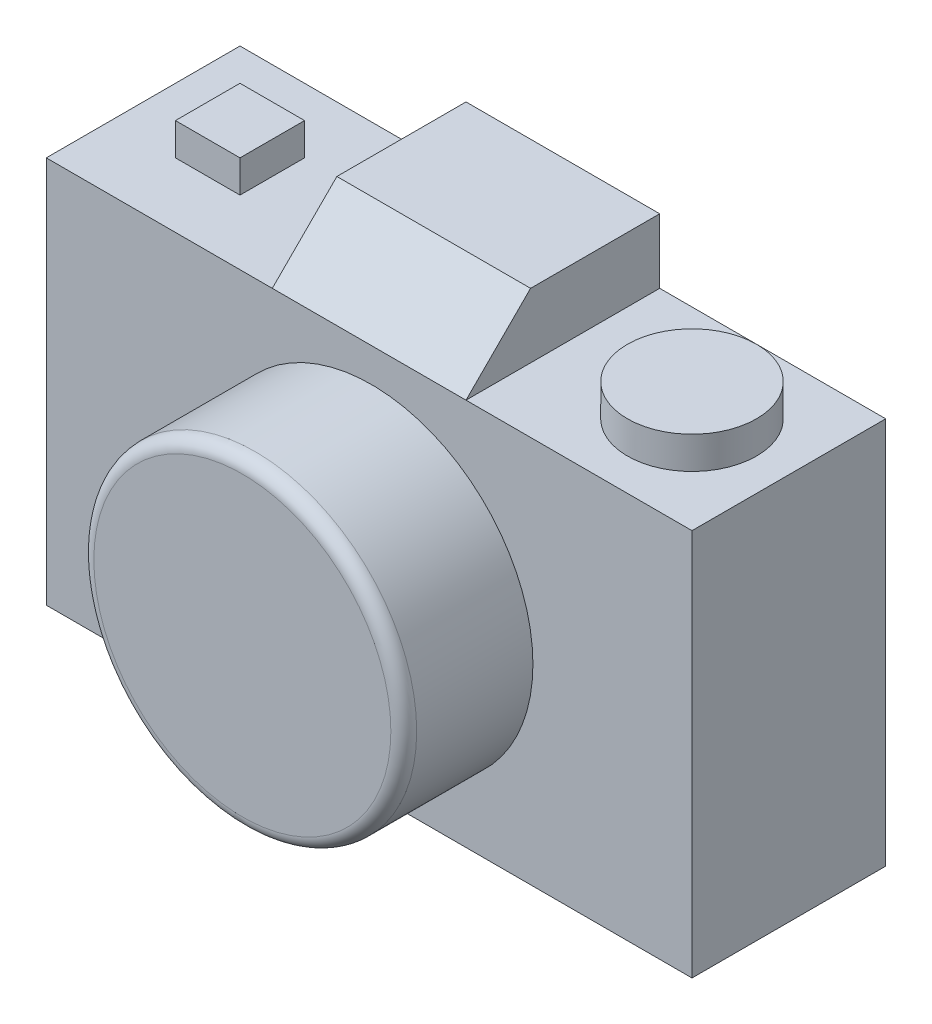
ISO-10303-21;
HEADER;
FILE_DESCRIPTION(('STEP AP214'),'2;1');
FILE_NAME('part.step','',(''),(''),'','','');
FILE_SCHEMA(('AUTOMOTIVE_DESIGN { 1 0 10303 214 1 1 1 1 }'));
ENDSEC;
DATA;
#1=APPLICATION_CONTEXT('core data for automotive mechanical design processes');
#2=APPLICATION_PROTOCOL_DEFINITION('international standard','automotive_design',2000,#1);
#3=PRODUCT_CONTEXT('',#1,'mechanical');
#4=PRODUCT('Part','Part','',(#3));
#5=PRODUCT_RELATED_PRODUCT_CATEGORY('part','',(#4));
#6=PRODUCT_DEFINITION_FORMATION('','',#4);
#7=PRODUCT_DEFINITION_CONTEXT('part definition',#1,'design');
#8=PRODUCT_DEFINITION('design','',#6,#7);
#9=PRODUCT_DEFINITION_SHAPE('','',#8);
#10=(LENGTH_UNIT() NAMED_UNIT(*) SI_UNIT(.MILLI.,.METRE.));
#11=(NAMED_UNIT(*) PLANE_ANGLE_UNIT() SI_UNIT($,.RADIAN.));
#12=(NAMED_UNIT(*) SI_UNIT($,.STERADIAN.) SOLID_ANGLE_UNIT());
#13=UNCERTAINTY_MEASURE_WITH_UNIT(LENGTH_MEASURE(1.E-05),#10,'distance_accuracy_value','');
#14=(GEOMETRIC_REPRESENTATION_CONTEXT(3) GLOBAL_UNCERTAINTY_ASSIGNED_CONTEXT((#13)) GLOBAL_UNIT_ASSIGNED_CONTEXT((#10,
#11,#12)) REPRESENTATION_CONTEXT('',''));
#15=CARTESIAN_POINT('',(0.,0.,0.));
#16=DIRECTION('',(0.,0.,1.));
#17=DIRECTION('',(1.,0.,0.));
#18=AXIS2_PLACEMENT_3D('',#15,#16,#17);
#19=CARTESIAN_POINT('',(52.8020565552699,27.6092544987146,30.));
#20=DIRECTION('',(0.,-1.,0.));
#21=DIRECTION('',(1.,0.,0.));
#22=AXIS2_PLACEMENT_3D('',#19,#20,#21);
#23=PLANE('',#22);
#24=CARTESIAN_POINT('',(37.8020565552699,27.6092544987146,15.));
#25=DIRECTION('',(0.,-1.,0.));
#26=DIRECTION('',(1.,0.,0.));
#27=AXIS2_PLACEMENT_3D('',#24,#25,#26);
#28=CIRCLE('',#27,10.);
#29=CARTESIAN_POINT('',(47.8020565552699,27.6092544987146,15.));
#30=VERTEX_POINT('',#29);
#31=EDGE_CURVE('E192',#30,#30,#28,.F.);
#32=ORIENTED_EDGE('',*,*,#31,.F.);
#33=EDGE_LOOP('',(#32));
#34=FACE_BOUND('',#33,.T.);
#35=DIRECTION('',(0.,0.,-1.));
#36=VECTOR('',#35,1.);
#37=CARTESIAN_POINT('',(17.8020565552699,27.6092544987146,0.));
#38=LINE('',#37,#36);
#39=CARTESIAN_POINT('',(17.8020565552699,27.6092544987146,30.));
#40=VERTEX_POINT('',#39);
#41=CARTESIAN_POINT('',(17.8020565552699,27.6092544987146,0.));
#42=VERTEX_POINT('',#41);
#43=EDGE_CURVE('E147',#40,#42,#38,.T.);
#44=ORIENTED_EDGE('',*,*,#43,.F.);
#45=DIRECTION('',(-1.,0.,0.));
#46=VECTOR('',#45,1.);
#47=CARTESIAN_POINT('',(52.8020565552699,27.6092544987146,30.));
#48=LINE('',#47,#46);
#49=CARTESIAN_POINT('',(52.8020565552699,27.6092544987146,30.));
#50=VERTEX_POINT('',#49);
#51=EDGE_CURVE('E203',#50,#40,#48,.T.);
#52=ORIENTED_EDGE('',*,*,#51,.F.);
#53=DIRECTION('',(0.,0.,-1.));
#54=VECTOR('',#53,1.);
#55=CARTESIAN_POINT('',(52.8020565552699,27.6092544987146,30.));
#56=LINE('',#55,#54);
#57=CARTESIAN_POINT('',(52.8020565552699,27.6092544987146,0.));
#58=VERTEX_POINT('',#57);
#59=EDGE_CURVE('E217',#50,#58,#56,.T.);
#60=ORIENTED_EDGE('',*,*,#59,.T.);
#61=DIRECTION('',(-1.,0.,0.));
#62=VECTOR('',#61,1.);
#63=CARTESIAN_POINT('',(52.8020565552699,27.6092544987146,0.));
#64=LINE('',#63,#62);
#65=EDGE_CURVE('E198',#58,#42,#64,.T.);
#66=ORIENTED_EDGE('',*,*,#65,.T.);
#67=EDGE_LOOP('',(#44,#52,#60,#66));
#68=FACE_BOUND('',#67,.T.);
#69=ADVANCED_FACE('F33',(#34,#68),#23,.F.);
#70=DIRECTION('',(0.,0.,-1.));
#71=VECTOR('',#70,1.);
#72=CARTESIAN_POINT('',(-27.1979434447301,27.6092544987147,10.));
#73=LINE('',#72,#71);
#74=CARTESIAN_POINT('',(-27.1979434447301,27.6092544987147,20.));
#75=VERTEX_POINT('',#74);
#76=CARTESIAN_POINT('',(-27.1979434447301,27.6092544987147,10.));
#77=VERTEX_POINT('',#76);
#78=EDGE_CURVE('E151',#75,#77,#73,.T.);
#79=ORIENTED_EDGE('',*,*,#78,.F.);
#80=DIRECTION('',(1.,0.,0.));
#81=VECTOR('',#80,1.);
#82=CARTESIAN_POINT('',(-37.1979434447301,27.6092544987147,20.));
#83=LINE('',#82,#81);
#84=CARTESIAN_POINT('',(-37.1979434447301,27.6092544987147,20.));
#85=VERTEX_POINT('',#84);
#86=EDGE_CURVE('E160',#85,#75,#83,.T.);
#87=ORIENTED_EDGE('',*,*,#86,.F.);
#88=DIRECTION('',(0.,0.,1.));
#89=VECTOR('',#88,1.);
#90=CARTESIAN_POINT('',(-37.1979434447301,27.6092544987147,10.));
#91=LINE('',#90,#89);
#92=CARTESIAN_POINT('',(-37.1979434447301,27.6092544987147,10.));
#93=VERTEX_POINT('',#92);
#94=EDGE_CURVE('E172',#93,#85,#91,.T.);
#95=ORIENTED_EDGE('',*,*,#94,.F.);
#96=DIRECTION('',(-1.,0.,0.));
#97=VECTOR('',#96,1.);
#98=CARTESIAN_POINT('',(-37.1979434447301,27.6092544987147,10.));
#99=LINE('',#98,#97);
#100=EDGE_CURVE('E169',#77,#93,#99,.T.);
#101=ORIENTED_EDGE('',*,*,#100,.F.);
#102=EDGE_LOOP('',(#79,#87,#95,#101));
#103=FACE_BOUND('',#102,.T.);
#104=DIRECTION('',(0.,0.,1.));
#105=VECTOR('',#104,1.);
#106=CARTESIAN_POINT('',(-12.1979434447301,27.6092544987147,0.));
#107=LINE('',#106,#105);
#108=CARTESIAN_POINT('',(-12.1979434447301,27.6092544987147,0.));
#109=VERTEX_POINT('',#108);
#110=CARTESIAN_POINT('',(-12.1979434447301,27.6092544987147,30.));
#111=VERTEX_POINT('',#110);
#112=EDGE_CURVE('E132',#109,#111,#107,.T.);
#113=ORIENTED_EDGE('',*,*,#112,.F.);
#114=CARTESIAN_POINT('',(-47.1979434447301,27.6092544987147,0.));
#115=VERTEX_POINT('',#114);
#116=EDGE_CURVE('E213',#109,#115,#64,.T.);
#117=ORIENTED_EDGE('',*,*,#116,.T.);
#118=DIRECTION('',(0.,0.,-1.));
#119=VECTOR('',#118,1.);
#120=CARTESIAN_POINT('',(-47.1979434447301,27.6092544987147,30.));
#121=LINE('',#120,#119);
#122=CARTESIAN_POINT('',(-47.1979434447301,27.6092544987147,30.));
#123=VERTEX_POINT('',#122);
#124=EDGE_CURVE('E206',#123,#115,#121,.T.);
#125=ORIENTED_EDGE('',*,*,#124,.F.);
#126=EDGE_CURVE('E202',#111,#123,#48,.T.);
#127=ORIENTED_EDGE('',*,*,#126,.F.);
#128=EDGE_LOOP('',(#113,#117,#125,#127));
#129=FACE_BOUND('',#128,.T.);
#130=ADVANCED_FACE('F244',(#103,#129),#23,.F.);
#131=CARTESIAN_POINT('',(-47.1979434447301,27.6092544987147,30.));
#132=DIRECTION('',(1.,0.,0.));
#133=DIRECTION('',(0.,0.,-1.));
#134=AXIS2_PLACEMENT_3D('',#131,#132,#133);
#135=PLANE('',#134);
#136=DIRECTION('',(0.,-1.,0.));
#137=VECTOR('',#136,1.);
#138=CARTESIAN_POINT('',(-47.1979434447301,27.6092544987147,0.));
#139=LINE('',#138,#137);
#140=CARTESIAN_POINT('',(-47.1979434447301,-32.3907455012854,0.));
#141=VERTEX_POINT('',#140);
#142=EDGE_CURVE('E188',#115,#141,#139,.T.);
#143=ORIENTED_EDGE('',*,*,#142,.T.);
#144=DIRECTION('',(0.,0.,-1.));
#145=VECTOR('',#144,1.);
#146=CARTESIAN_POINT('',(-47.1979434447301,-32.3907455012854,30.));
#147=LINE('',#146,#145);
#148=CARTESIAN_POINT('',(-47.1979434447301,-32.3907455012854,30.));
#149=VERTEX_POINT('',#148);
#150=EDGE_CURVE('E193',#149,#141,#147,.T.);
#151=ORIENTED_EDGE('',*,*,#150,.F.);
#152=DIRECTION('',(0.,-1.,0.));
#153=VECTOR('',#152,1.);
#154=CARTESIAN_POINT('',(-47.1979434447301,27.6092544987147,30.));
#155=LINE('',#154,#153);
#156=EDGE_CURVE('E194',#123,#149,#155,.T.);
#157=ORIENTED_EDGE('',*,*,#156,.F.);
#158=ORIENTED_EDGE('',*,*,#124,.T.);
#159=EDGE_LOOP('',(#143,#151,#157,#158));
#160=FACE_BOUND('',#159,.T.);
#161=ADVANCED_FACE('F250',(#160),#135,.F.);
#162=CARTESIAN_POINT('',(-47.1979434447301,-32.3907455012854,30.));
#163=DIRECTION('',(0.,1.,0.));
#164=DIRECTION('',(0.,0.,1.));
#165=AXIS2_PLACEMENT_3D('',#162,#163,#164);
#166=PLANE('',#165);
#167=DIRECTION('',(1.,0.,0.));
#168=VECTOR('',#167,1.);
#169=CARTESIAN_POINT('',(-47.1979434447301,-32.3907455012854,0.));
#170=LINE('',#169,#168);
#171=CARTESIAN_POINT('',(52.8020565552699,-32.3907455012854,0.));
#172=VERTEX_POINT('',#171);
#173=EDGE_CURVE('E209',#141,#172,#170,.T.);
#174=ORIENTED_EDGE('',*,*,#173,.T.);
#175=DIRECTION('',(0.,0.,-1.));
#176=VECTOR('',#175,1.);
#177=CARTESIAN_POINT('',(52.8020565552699,-32.3907455012854,30.));
#178=LINE('',#177,#176);
#179=CARTESIAN_POINT('',(52.8020565552699,-32.3907455012854,30.));
#180=VERTEX_POINT('',#179);
#181=EDGE_CURVE('E220',#180,#172,#178,.T.);
#182=ORIENTED_EDGE('',*,*,#181,.F.);
#183=DIRECTION('',(1.,0.,0.));
#184=VECTOR('',#183,1.);
#185=CARTESIAN_POINT('',(-47.1979434447301,-32.3907455012854,30.));
#186=LINE('',#185,#184);
#187=EDGE_CURVE('E197',#149,#180,#186,.T.);
#188=ORIENTED_EDGE('',*,*,#187,.F.);
#189=ORIENTED_EDGE('',*,*,#150,.T.);
#190=EDGE_LOOP('',(#174,#182,#188,#189));
#191=FACE_BOUND('',#190,.T.);
#192=ADVANCED_FACE('F261',(#191),#166,.F.);
#193=CARTESIAN_POINT('',(52.8020565552699,-32.3907455012854,30.));
#194=DIRECTION('',(-1.,0.,0.));
#195=DIRECTION('',(0.,0.,1.));
#196=AXIS2_PLACEMENT_3D('',#193,#194,#195);
#197=PLANE('',#196);
#198=DIRECTION('',(0.,1.,0.));
#199=VECTOR('',#198,1.);
#200=CARTESIAN_POINT('',(52.8020565552699,-32.3907455012854,0.));
#201=LINE('',#200,#199);
#202=EDGE_CURVE('E211',#172,#58,#201,.T.);
#203=ORIENTED_EDGE('',*,*,#202,.T.);
#204=ORIENTED_EDGE('',*,*,#59,.F.);
#205=DIRECTION('',(0.,1.,0.));
#206=VECTOR('',#205,1.);
#207=CARTESIAN_POINT('',(52.8020565552699,-32.3907455012854,30.));
#208=LINE('',#207,#206);
#209=EDGE_CURVE('E200',#180,#50,#208,.T.);
#210=ORIENTED_EDGE('',*,*,#209,.F.);
#211=ORIENTED_EDGE('',*,*,#181,.T.);
#212=EDGE_LOOP('',(#203,#204,#210,#211));
#213=FACE_BOUND('',#212,.T.);
#214=ADVANCED_FACE('F257',(#213),#197,.F.);
#215=CARTESIAN_POINT('',(0.,0.,30.));
#216=DIRECTION('',(0.,0.,1.));
#217=DIRECTION('',(1.,0.,0.));
#218=AXIS2_PLACEMENT_3D('',#215,#216,#217);
#219=PLANE('',#218);
#220=CARTESIAN_POINT('',(3.16571328794909,-2.60893954089285,30.));
#221=DIRECTION('',(0.,0.,1.));
#222=DIRECTION('',(1.,0.,0.));
#223=AXIS2_PLACEMENT_3D('',#220,#221,#222);
#224=CIRCLE('',#223,25.);
#225=CARTESIAN_POINT('',(28.1657132879491,-2.60893954089285,30.));
#226=VERTEX_POINT('',#225);
#227=EDGE_CURVE('E189',#226,#226,#224,.T.);
#228=ORIENTED_EDGE('',*,*,#227,.F.);
#229=EDGE_LOOP('',(#228));
#230=FACE_BOUND('',#229,.T.);
#231=ORIENTED_EDGE('',*,*,#51,.T.);
#232=DIRECTION('',(-1.,0.,0.));
#233=VECTOR('',#232,1.);
#234=CARTESIAN_POINT('',(0.,27.6092544987146,30.));
#235=LINE('',#234,#233);
#236=EDGE_CURVE('E229',#40,#111,#235,.T.);
#237=ORIENTED_EDGE('',*,*,#236,.T.);
#238=ORIENTED_EDGE('',*,*,#126,.T.);
#239=ORIENTED_EDGE('',*,*,#156,.T.);
#240=ORIENTED_EDGE('',*,*,#187,.T.);
#241=ORIENTED_EDGE('',*,*,#209,.T.);
#242=EDGE_LOOP('',(#231,#237,#238,#239,#240,#241));
#243=FACE_BOUND('',#242,.T.);
#244=ADVANCED_FACE('F260',(#230,#243),#219,.T.);
#245=CARTESIAN_POINT('',(0.,0.,0.));
#246=DIRECTION('',(0.,0.,1.));
#247=DIRECTION('',(1.,0.,0.));
#248=AXIS2_PLACEMENT_3D('',#245,#246,#247);
#249=PLANE('',#248);
#250=ORIENTED_EDGE('',*,*,#142,.F.);
#251=ORIENTED_EDGE('',*,*,#116,.F.);
#252=DIRECTION('',(0.,-1.,0.));
#253=VECTOR('',#252,1.);
#254=CARTESIAN_POINT('',(-12.1979434447301,37.6092544987147,0.));
#255=LINE('',#254,#253);
#256=CARTESIAN_POINT('',(-12.1979434447301,37.6092544987147,0.));
#257=VERTEX_POINT('',#256);
#258=EDGE_CURVE('E142',#257,#109,#255,.T.);
#259=ORIENTED_EDGE('',*,*,#258,.F.);
#260=DIRECTION('',(-1.,0.,0.));
#261=VECTOR('',#260,1.);
#262=CARTESIAN_POINT('',(-12.1979434447301,37.6092544987147,0.));
#263=LINE('',#262,#261);
#264=CARTESIAN_POINT('',(17.8020565552699,37.6092544987146,0.));
#265=VERTEX_POINT('',#264);
#266=EDGE_CURVE('E127',#265,#257,#263,.T.);
#267=ORIENTED_EDGE('',*,*,#266,.F.);
#268=DIRECTION('',(0.,-1.,0.));
#269=VECTOR('',#268,1.);
#270=CARTESIAN_POINT('',(17.8020565552699,37.6092544987146,0.));
#271=LINE('',#270,#269);
#272=EDGE_CURVE('E139',#265,#42,#271,.T.);
#273=ORIENTED_EDGE('',*,*,#272,.T.);
#274=ORIENTED_EDGE('',*,*,#65,.F.);
#275=ORIENTED_EDGE('',*,*,#202,.F.);
#276=ORIENTED_EDGE('',*,*,#173,.F.);
#277=EDGE_LOOP('',(#250,#251,#259,#267,#273,#274,#275,#276));
#278=FACE_BOUND('',#277,.T.);
#279=ADVANCED_FACE('F137',(#278),#249,.F.);
#280=CARTESIAN_POINT('',(3.16571328794909,-2.60893954089285,50.));
#281=DIRECTION('',(0.,0.,-1.));
#282=DIRECTION('',(-1.,0.,0.));
#283=AXIS2_PLACEMENT_3D('',#280,#281,#282);
#284=CYLINDRICAL_SURFACE('',#283,25.);
#285=CARTESIAN_POINT('',(3.16571328794909,-2.60893954089285,48.));
#286=DIRECTION('',(0.,0.,1.));
#287=DIRECTION('',(1.,0.,0.));
#288=AXIS2_PLACEMENT_3D('',#285,#286,#287);
#289=CIRCLE('',#288,25.);
#290=CARTESIAN_POINT('',(28.1657132879491,-2.60893954089285,48.));
#291=VERTEX_POINT('',#290);
#292=EDGE_CURVE('E11',#291,#291,#289,.F.);
#293=ORIENTED_EDGE('',*,*,#292,.T.);
#294=EDGE_LOOP('',(#293));
#295=FACE_BOUND('',#294,.T.);
#296=ORIENTED_EDGE('',*,*,#227,.T.);
#297=EDGE_LOOP('',(#296));
#298=FACE_BOUND('',#297,.T.);
#299=ADVANCED_FACE('F322',(#295,#298),#284,.T.);
#300=CARTESIAN_POINT('',(3.16571328794909,-2.60893954089285,50.));
#301=DIRECTION('',(0.,0.,1.));
#302=DIRECTION('',(1.,0.,0.));
#303=AXIS2_PLACEMENT_3D('',#300,#301,#302);
#304=PLANE('',#303);
#305=CARTESIAN_POINT('',(3.16571328794909,-2.60893954089285,50.));
#306=DIRECTION('',(0.,0.,1.));
#307=DIRECTION('',(1.,0.,0.));
#308=AXIS2_PLACEMENT_3D('',#305,#306,#307);
#309=CIRCLE('',#308,23.);
#310=CARTESIAN_POINT('',(26.1657132879491,-2.60893954089285,50.));
#311=VERTEX_POINT('',#310);
#312=EDGE_CURVE('E41',#311,#311,#309,.T.);
#313=ORIENTED_EDGE('',*,*,#312,.T.);
#314=EDGE_LOOP('',(#313));
#315=FACE_BOUND('',#314,.T.);
#316=ADVANCED_FACE('F234',(#315),#304,.T.);
#317=CARTESIAN_POINT('',(-27.1979434447301,32.6092544987147,10.));
#318=DIRECTION('',(-1.,0.,0.));
#319=DIRECTION('',(0.,0.,1.));
#320=AXIS2_PLACEMENT_3D('',#317,#318,#319);
#321=PLANE('',#320);
#322=ORIENTED_EDGE('',*,*,#78,.T.);
#323=DIRECTION('',(0.,-1.,0.));
#324=VECTOR('',#323,1.);
#325=CARTESIAN_POINT('',(-27.1979434447301,32.6092544987147,10.));
#326=LINE('',#325,#324);
#327=CARTESIAN_POINT('',(-27.1979434447301,32.6092544987147,10.));
#328=VERTEX_POINT('',#327);
#329=EDGE_CURVE('E185',#328,#77,#326,.T.);
#330=ORIENTED_EDGE('',*,*,#329,.F.);
#331=DIRECTION('',(0.,0.,-1.));
#332=VECTOR('',#331,1.);
#333=CARTESIAN_POINT('',(-27.1979434447301,32.6092544987147,10.));
#334=LINE('',#333,#332);
#335=CARTESIAN_POINT('',(-27.1979434447301,32.6092544987147,20.));
#336=VERTEX_POINT('',#335);
#337=EDGE_CURVE('E156',#336,#328,#334,.T.);
#338=ORIENTED_EDGE('',*,*,#337,.F.);
#339=DIRECTION('',(0.,-1.,0.));
#340=VECTOR('',#339,1.);
#341=CARTESIAN_POINT('',(-27.1979434447301,32.6092544987147,20.));
#342=LINE('',#341,#340);
#343=EDGE_CURVE('E166',#336,#75,#342,.T.);
#344=ORIENTED_EDGE('',*,*,#343,.T.);
#345=EDGE_LOOP('',(#322,#330,#338,#344));
#346=FACE_BOUND('',#345,.T.);
#347=ADVANCED_FACE('F315',(#346),#321,.F.);
#348=CARTESIAN_POINT('',(-37.1979434447301,32.6092544987147,10.));
#349=DIRECTION('',(0.,0.,1.));
#350=DIRECTION('',(1.,0.,0.));
#351=AXIS2_PLACEMENT_3D('',#348,#349,#350);
#352=PLANE('',#351);
#353=ORIENTED_EDGE('',*,*,#100,.T.);
#354=DIRECTION('',(0.,-1.,0.));
#355=VECTOR('',#354,1.);
#356=CARTESIAN_POINT('',(-37.1979434447301,32.6092544987147,10.));
#357=LINE('',#356,#355);
#358=CARTESIAN_POINT('',(-37.1979434447301,32.6092544987147,10.));
#359=VERTEX_POINT('',#358);
#360=EDGE_CURVE('E182',#359,#93,#357,.T.);
#361=ORIENTED_EDGE('',*,*,#360,.F.);
#362=DIRECTION('',(-1.,0.,0.));
#363=VECTOR('',#362,1.);
#364=CARTESIAN_POINT('',(-37.1979434447301,32.6092544987147,10.));
#365=LINE('',#364,#363);
#366=EDGE_CURVE('E159',#328,#359,#365,.T.);
#367=ORIENTED_EDGE('',*,*,#366,.F.);
#368=ORIENTED_EDGE('',*,*,#329,.T.);
#369=EDGE_LOOP('',(#353,#361,#367,#368));
#370=FACE_BOUND('',#369,.T.);
#371=ADVANCED_FACE('F311',(#370),#352,.F.);
#372=CARTESIAN_POINT('',(-37.1979434447301,32.6092544987147,10.));
#373=DIRECTION('',(1.,0.,0.));
#374=DIRECTION('',(0.,1.,0.));
#375=AXIS2_PLACEMENT_3D('',#372,#373,#374);
#376=PLANE('',#375);
#377=ORIENTED_EDGE('',*,*,#94,.T.);
#378=DIRECTION('',(0.,-1.,0.));
#379=VECTOR('',#378,1.);
#380=CARTESIAN_POINT('',(-37.1979434447301,32.6092544987147,20.));
#381=LINE('',#380,#379);
#382=CARTESIAN_POINT('',(-37.1979434447301,32.6092544987147,20.));
#383=VERTEX_POINT('',#382);
#384=EDGE_CURVE('E179',#383,#85,#381,.T.);
#385=ORIENTED_EDGE('',*,*,#384,.F.);
#386=DIRECTION('',(0.,0.,1.));
#387=VECTOR('',#386,1.);
#388=CARTESIAN_POINT('',(-37.1979434447301,32.6092544987147,10.));
#389=LINE('',#388,#387);
#390=EDGE_CURVE('E162',#359,#383,#389,.T.);
#391=ORIENTED_EDGE('',*,*,#390,.F.);
#392=ORIENTED_EDGE('',*,*,#360,.T.);
#393=EDGE_LOOP('',(#377,#385,#391,#392));
#394=FACE_BOUND('',#393,.T.);
#395=ADVANCED_FACE('F307',(#394),#376,.F.);
#396=CARTESIAN_POINT('',(-37.1979434447301,32.6092544987147,20.));
#397=DIRECTION('',(0.,0.,-1.));
#398=DIRECTION('',(-1.,0.,0.));
#399=AXIS2_PLACEMENT_3D('',#396,#397,#398);
#400=PLANE('',#399);
#401=ORIENTED_EDGE('',*,*,#86,.T.);
#402=ORIENTED_EDGE('',*,*,#343,.F.);
#403=DIRECTION('',(1.,0.,0.));
#404=VECTOR('',#403,1.);
#405=CARTESIAN_POINT('',(-37.1979434447301,32.6092544987147,20.));
#406=LINE('',#405,#404);
#407=EDGE_CURVE('E164',#383,#336,#406,.T.);
#408=ORIENTED_EDGE('',*,*,#407,.F.);
#409=ORIENTED_EDGE('',*,*,#384,.T.);
#410=EDGE_LOOP('',(#401,#402,#408,#409));
#411=FACE_BOUND('',#410,.T.);
#412=ADVANCED_FACE('F303',(#411),#400,.F.);
#413=CARTESIAN_POINT('',(0.,32.6092544987147,0.));
#414=DIRECTION('',(0.,1.,0.));
#415=DIRECTION('',(0.,0.,1.));
#416=AXIS2_PLACEMENT_3D('',#413,#414,#415);
#417=PLANE('',#416);
#418=ORIENTED_EDGE('',*,*,#337,.T.);
#419=ORIENTED_EDGE('',*,*,#366,.T.);
#420=ORIENTED_EDGE('',*,*,#390,.T.);
#421=ORIENTED_EDGE('',*,*,#407,.T.);
#422=EDGE_LOOP('',(#418,#419,#420,#421));
#423=FACE_BOUND('',#422,.T.);
#424=ADVANCED_FACE('F299',(#423),#417,.T.);
#425=CARTESIAN_POINT('',(37.8020565552699,32.6092544987146,15.));
#426=DIRECTION('',(0.,-1.,0.));
#427=DIRECTION('',(1.,0.,0.));
#428=AXIS2_PLACEMENT_3D('',#425,#426,#427);
#429=CYLINDRICAL_SURFACE('',#428,10.);
#430=CARTESIAN_POINT('',(37.8020565552699,32.6092544987146,15.));
#431=DIRECTION('',(0.,1.,0.));
#432=DIRECTION('',(-1.,0.,0.));
#433=AXIS2_PLACEMENT_3D('',#430,#431,#432);
#434=CIRCLE('',#433,10.);
#435=CARTESIAN_POINT('',(27.8020565552699,32.6092544987146,15.));
#436=VERTEX_POINT('',#435);
#437=EDGE_CURVE('E148',#436,#436,#434,.T.);
#438=ORIENTED_EDGE('',*,*,#437,.F.);
#439=EDGE_LOOP('',(#438));
#440=FACE_BOUND('',#439,.T.);
#441=ORIENTED_EDGE('',*,*,#31,.T.);
#442=EDGE_LOOP('',(#441));
#443=FACE_BOUND('',#442,.T.);
#444=ADVANCED_FACE('F295',(#440,#443),#429,.T.);
#445=CARTESIAN_POINT('',(37.8020565552699,32.6092544987146,15.));
#446=DIRECTION('',(0.,1.,0.));
#447=DIRECTION('',(-1.,0.,0.));
#448=AXIS2_PLACEMENT_3D('',#445,#446,#447);
#449=PLANE('',#448);
#450=ORIENTED_EDGE('',*,*,#437,.T.);
#451=EDGE_LOOP('',(#450));
#452=FACE_BOUND('',#451,.T.);
#453=ADVANCED_FACE('F290',(#452),#449,.T.);
#454=CARTESIAN_POINT('',(17.8020565552699,37.6092544987146,0.));
#455=DIRECTION('',(-1.,0.,0.));
#456=DIRECTION('',(0.,0.,1.));
#457=AXIS2_PLACEMENT_3D('',#454,#455,#456);
#458=PLANE('',#457);
#459=DIRECTION('',(0.,0.,-1.));
#460=VECTOR('',#459,1.);
#461=CARTESIAN_POINT('',(17.8020565552699,37.6092544987146,0.));
#462=LINE('',#461,#460);
#463=CARTESIAN_POINT('',(17.8020565552699,37.6092544987146,20.));
#464=VERTEX_POINT('',#463);
#465=EDGE_CURVE('E124',#464,#265,#462,.T.);
#466=ORIENTED_EDGE('',*,*,#465,.F.);
#467=DIRECTION('',(0.,0.707106781186549,-0.707106781186547));
#468=VECTOR('',#467,1.);
#469=CARTESIAN_POINT('',(17.8020565552699,37.6092544987147,20.));
#470=LINE('',#469,#468);
#471=EDGE_CURVE('E56',#464,#40,#470,.F.);
#472=ORIENTED_EDGE('',*,*,#471,.T.);
#473=ORIENTED_EDGE('',*,*,#43,.T.);
#474=ORIENTED_EDGE('',*,*,#272,.F.);
#475=EDGE_LOOP('',(#466,#472,#473,#474));
#476=FACE_BOUND('',#475,.T.);
#477=ADVANCED_FACE('F145',(#476),#458,.F.);
#478=CARTESIAN_POINT('',(-12.1979434447301,37.6092544987147,0.));
#479=DIRECTION('',(1.,0.,0.));
#480=DIRECTION('',(0.,1.,0.));
#481=AXIS2_PLACEMENT_3D('',#478,#479,#480);
#482=PLANE('',#481);
#483=ORIENTED_EDGE('',*,*,#112,.T.);
#484=DIRECTION('',(0.,-0.707106781186549,0.707106781186547));
#485=VECTOR('',#484,1.);
#486=CARTESIAN_POINT('',(-12.1979434447301,37.6092544987147,20.));
#487=LINE('',#486,#485);
#488=CARTESIAN_POINT('',(-12.1979434447301,37.6092544987147,20.));
#489=VERTEX_POINT('',#488);
#490=EDGE_CURVE('E48',#111,#489,#487,.F.);
#491=ORIENTED_EDGE('',*,*,#490,.T.);
#492=DIRECTION('',(0.,0.,1.));
#493=VECTOR('',#492,1.);
#494=CARTESIAN_POINT('',(-12.1979434447301,37.6092544987147,0.));
#495=LINE('',#494,#493);
#496=EDGE_CURVE('E143',#257,#489,#495,.T.);
#497=ORIENTED_EDGE('',*,*,#496,.F.);
#498=ORIENTED_EDGE('',*,*,#258,.T.);
#499=EDGE_LOOP('',(#483,#491,#497,#498));
#500=FACE_BOUND('',#499,.T.);
#501=ADVANCED_FACE('F280',(#500),#482,.F.);
#502=CARTESIAN_POINT('',(0.,37.6092544987147,0.));
#503=DIRECTION('',(0.,1.,0.));
#504=DIRECTION('',(-1.,0.,0.));
#505=AXIS2_PLACEMENT_3D('',#502,#503,#504);
#506=PLANE('',#505);
#507=ORIENTED_EDGE('',*,*,#496,.T.);
#508=DIRECTION('',(1.,0.,0.));
#509=VECTOR('',#508,1.);
#510=CARTESIAN_POINT('',(0.,37.6092544987147,20.));
#511=LINE('',#510,#509);
#512=EDGE_CURVE('E129',#489,#464,#511,.T.);
#513=ORIENTED_EDGE('',*,*,#512,.T.);
#514=ORIENTED_EDGE('',*,*,#465,.T.);
#515=ORIENTED_EDGE('',*,*,#266,.T.);
#516=EDGE_LOOP('',(#507,#513,#514,#515));
#517=FACE_BOUND('',#516,.T.);
#518=ADVANCED_FACE('F126',(#517),#506,.T.);
#519=CARTESIAN_POINT('',(0.,37.6092544987147,20.));
#520=DIRECTION('',(0.,-0.707106781186546,-0.707106781186548));
#521=DIRECTION('',(1.,0.,0.));
#522=AXIS2_PLACEMENT_3D('',#519,#520,#521);
#523=PLANE('',#522);
#524=ORIENTED_EDGE('',*,*,#490,.F.);
#525=ORIENTED_EDGE('',*,*,#236,.F.);
#526=ORIENTED_EDGE('',*,*,#471,.F.);
#527=ORIENTED_EDGE('',*,*,#512,.F.);
#528=EDGE_LOOP('',(#524,#525,#526,#527));
#529=FACE_BOUND('',#528,.T.);
#530=ADVANCED_FACE('F237',(#529),#523,.F.);
#531=CARTESIAN_POINT('',(3.16571328794909,-2.60893954089285,48.));
#532=DIRECTION('',(0.,0.,1.));
#533=DIRECTION('',(1.,0.,0.));
#534=AXIS2_PLACEMENT_3D('',#531,#532,#533);
#535=TOROIDAL_SURFACE('',#534,23.,2.);
#536=ORIENTED_EDGE('',*,*,#292,.F.);
#537=EDGE_LOOP('',(#536));
#538=FACE_BOUND('',#537,.T.);
#539=ORIENTED_EDGE('',*,*,#312,.F.);
#540=EDGE_LOOP('',(#539));
#541=FACE_BOUND('',#540,.T.);
#542=ADVANCED_FACE('F35',(#538,#541),#535,.T.);
#543=CLOSED_SHELL('',(#69,#130,#161,#192,#214,#244,#279,#299,#316,#347,#371,#395,#412,#424,#444,
#453,#477,#501,#518,#530,#542));
#544=MANIFOLD_SOLID_BREP('B2',#543);
#545=ADVANCED_BREP_SHAPE_REPRESENTATION('',(#18,#544),#14);
#546=SHAPE_DEFINITION_REPRESENTATION(#9,#545);
ENDSEC;
END-ISO-10303-21;
